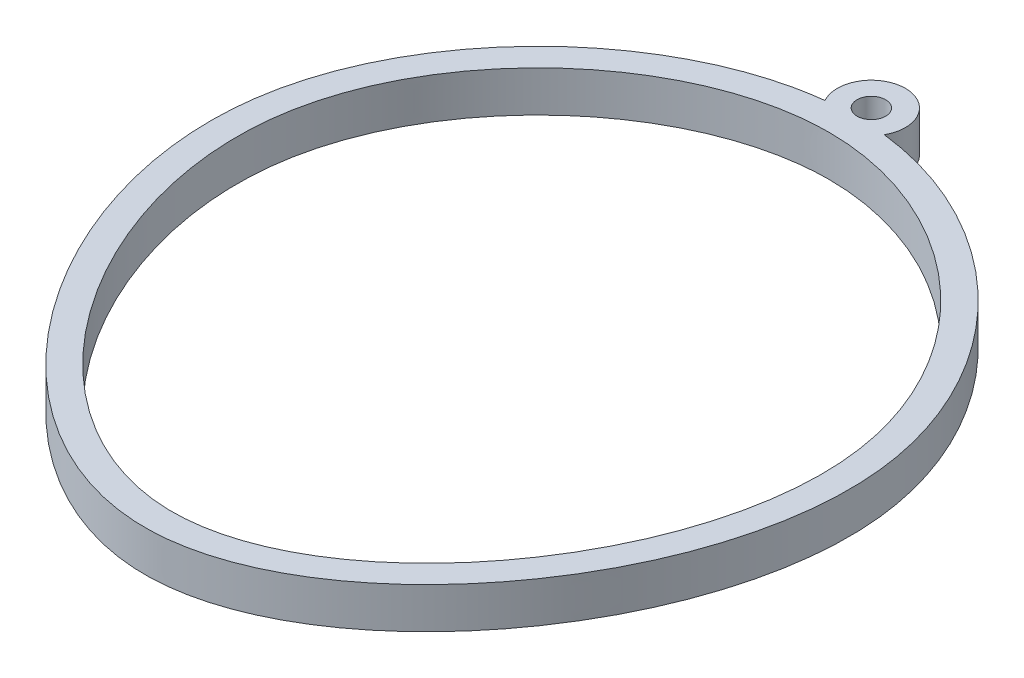
ISO-10303-21;
HEADER;
FILE_DESCRIPTION(('STEP AP214'),'2;1');
FILE_NAME('part.step','',(''),(''),'','','');
FILE_SCHEMA(('AUTOMOTIVE_DESIGN { 1 0 10303 214 1 1 1 1 }'));
ENDSEC;
DATA;
#1=APPLICATION_CONTEXT('core data for automotive mechanical design processes');
#2=APPLICATION_PROTOCOL_DEFINITION('international standard','automotive_design',2000,#1);
#3=PRODUCT_CONTEXT('',#1,'mechanical');
#4=PRODUCT('Part','Part','',(#3));
#5=PRODUCT_RELATED_PRODUCT_CATEGORY('part','',(#4));
#6=PRODUCT_DEFINITION_FORMATION('','',#4);
#7=PRODUCT_DEFINITION_CONTEXT('part definition',#1,'design');
#8=PRODUCT_DEFINITION('design','',#6,#7);
#9=PRODUCT_DEFINITION_SHAPE('','',#8);
#10=(LENGTH_UNIT() NAMED_UNIT(*) SI_UNIT(.MILLI.,.METRE.));
#11=(NAMED_UNIT(*) PLANE_ANGLE_UNIT() SI_UNIT($,.RADIAN.));
#12=(NAMED_UNIT(*) SI_UNIT($,.STERADIAN.) SOLID_ANGLE_UNIT());
#13=UNCERTAINTY_MEASURE_WITH_UNIT(LENGTH_MEASURE(1.E-05),#10,'distance_accuracy_value','');
#14=(GEOMETRIC_REPRESENTATION_CONTEXT(3) GLOBAL_UNCERTAINTY_ASSIGNED_CONTEXT((#13)) GLOBAL_UNIT_ASSIGNED_CONTEXT((#10,
#11,#12)) REPRESENTATION_CONTEXT('',''));
#15=CARTESIAN_POINT('',(0.,0.,0.));
#16=DIRECTION('',(0.,0.,1.));
#17=DIRECTION('',(1.,0.,0.));
#18=AXIS2_PLACEMENT_3D('',#15,#16,#17);
#19=CARTESIAN_POINT('',(0.,3.,-22.243));
#20=DIRECTION('',(0.,-1.,0.));
#21=DIRECTION('',(0.,0.,-1.));
#22=AXIS2_PLACEMENT_3D('',#19,#20,#21);
#23=CYLINDRICAL_SURFACE('',#22,2.50000000000001);
#24=CARTESIAN_POINT('',(0.,0.,-22.243));
#25=DIRECTION('',(0.,1.,0.));
#26=DIRECTION('',(0.,0.,1.));
#27=AXIS2_PLACEMENT_3D('',#24,#25,#26);
#28=CIRCLE('',#27,2.50000000000001);
#29=CARTESIAN_POINT('',(2.1782776813823,0.,-21.0161722440408));
#30=VERTEX_POINT('',#29);
#31=CARTESIAN_POINT('',(-2.1782776813823,0.,-21.0161722440408));
#32=VERTEX_POINT('',#31);
#33=EDGE_CURVE('E62',#30,#32,#28,.T.);
#34=ORIENTED_EDGE('',*,*,#33,.T.);
#35=DIRECTION('',(0.,-1.,0.));
#36=VECTOR('',#35,1.);
#37=CARTESIAN_POINT('',(-2.1782776813823,3.,-21.0161722440408));
#38=LINE('',#37,#36);
#39=CARTESIAN_POINT('',(-2.1782776813823,3.,-21.0161722440408));
#40=VERTEX_POINT('',#39);
#41=EDGE_CURVE('E11',#40,#32,#38,.T.);
#42=ORIENTED_EDGE('',*,*,#41,.F.);
#43=CARTESIAN_POINT('',(0.,3.,-22.243));
#44=DIRECTION('',(0.,1.,0.));
#45=DIRECTION('',(0.,0.,1.));
#46=AXIS2_PLACEMENT_3D('',#43,#44,#45);
#47=CIRCLE('',#46,2.50000000000001);
#48=CARTESIAN_POINT('',(2.1782776813823,3.,-21.0161722440408));
#49=VERTEX_POINT('',#48);
#50=EDGE_CURVE('E64',#49,#40,#47,.T.);
#51=ORIENTED_EDGE('',*,*,#50,.F.);
#52=DIRECTION('',(0.,-1.,0.));
#53=VECTOR('',#52,1.);
#54=CARTESIAN_POINT('',(2.1782776813823,3.,-21.0161722440408));
#55=LINE('',#54,#53);
#56=EDGE_CURVE('E46',#49,#30,#55,.T.);
#57=ORIENTED_EDGE('',*,*,#56,.T.);
#58=EDGE_LOOP('',(#34,#42,#51,#57));
#59=FACE_BOUND('',#58,.T.);
#60=ADVANCED_FACE('F37',(#59),#23,.T.);
#61=CARTESIAN_POINT('',(0.,3.,-21.143));
#62=CARTESIAN_POINT('',(10.895147515051,3.,-21.143));
#63=CARTESIAN_POINT('',(35.2538195250686,3.,0.474726308047918));
#64=CARTESIAN_POINT('',(0.,3.,48.0473857565571));
#65=CARTESIAN_POINT('',(-35.2538195250686,3.,0.474726308047905));
#66=CARTESIAN_POINT('',(-10.895147515051,3.,-21.143));
#67=CARTESIAN_POINT('',(0.,3.,-21.143));
#68=B_SPLINE_CURVE_WITH_KNOTS('',3,(#61,#62,#63,#64,#65,#66,#67),.UNSPECIFIED.,.T.,.F.,(4,1,1,1,
4),(0.,0.223640014335968,0.5,0.776359985664032,1.),.UNSPECIFIED.);
#69=DIRECTION('',(0.,-1.,0.));
#70=VECTOR('',#69,1.);
#71=SURFACE_OF_LINEAR_EXTRUSION('',#68,#70);
#72=CARTESIAN_POINT('',(0.,0.,-21.143));
#73=CARTESIAN_POINT('',(10.895147515051,0.,-21.143));
#74=CARTESIAN_POINT('',(35.2538195250686,0.,0.474726308047918));
#75=CARTESIAN_POINT('',(0.,0.,48.0473857565571));
#76=CARTESIAN_POINT('',(-35.2538195250686,0.,0.474726308047905));
#77=CARTESIAN_POINT('',(-10.895147515051,0.,-21.143));
#78=CARTESIAN_POINT('',(0.,0.,-21.143));
#79=B_SPLINE_CURVE_WITH_KNOTS('',3,(#72,#73,#74,#75,#76,#77,#78),.UNSPECIFIED.,.T.,.F.,(4,1,1,1,
4),(0.,0.223640014335968,0.5,0.776359985664032,1.),.UNSPECIFIED.);
#80=EDGE_CURVE('E70',#30,#32,#79,.T.);
#81=ORIENTED_EDGE('',*,*,#80,.F.);
#82=ORIENTED_EDGE('',*,*,#56,.F.);
#83=EDGE_CURVE('E97',#49,#40,#68,.T.);
#84=ORIENTED_EDGE('',*,*,#83,.T.);
#85=ORIENTED_EDGE('',*,*,#41,.T.);
#86=EDGE_LOOP('',(#81,#82,#84,#85));
#87=FACE_BOUND('',#86,.T.);
#88=ADVANCED_FACE('F73',(#87),#71,.T.);
#89=CARTESIAN_POINT('',(0.,3.,-22.243));
#90=DIRECTION('',(0.,-1.,0.));
#91=DIRECTION('',(0.,0.,-1.));
#92=AXIS2_PLACEMENT_3D('',#89,#90,#91);
#93=CYLINDRICAL_SURFACE('',#92,1.05);
#94=CARTESIAN_POINT('',(0.,3.,-22.243));
#95=DIRECTION('',(0.,1.,0.));
#96=DIRECTION('',(0.,0.,1.));
#97=AXIS2_PLACEMENT_3D('',#94,#95,#96);
#98=CIRCLE('',#97,1.05);
#99=CARTESIAN_POINT('',(0.,3.,-21.193));
#100=VERTEX_POINT('',#99);
#101=EDGE_CURVE('E77',#100,#100,#98,.T.);
#102=ORIENTED_EDGE('',*,*,#101,.T.);
#103=EDGE_LOOP('',(#102));
#104=FACE_BOUND('',#103,.T.);
#105=CARTESIAN_POINT('',(0.,0.,-22.243));
#106=DIRECTION('',(0.,1.,0.));
#107=DIRECTION('',(0.,0.,1.));
#108=AXIS2_PLACEMENT_3D('',#105,#106,#107);
#109=CIRCLE('',#108,1.05);
#110=CARTESIAN_POINT('',(0.,0.,-21.193));
#111=VERTEX_POINT('',#110);
#112=EDGE_CURVE('E71',#111,#111,#109,.T.);
#113=ORIENTED_EDGE('',*,*,#112,.F.);
#114=EDGE_LOOP('',(#113));
#115=FACE_BOUND('',#114,.T.);
#116=ADVANCED_FACE('F39',(#104,#115),#93,.F.);
#117=CARTESIAN_POINT('',(0.,3.,-19.143));
#118=CARTESIAN_POINT('',(9.90355064316213,3.,-19.143));
#119=CARTESIAN_POINT('',(32.2853152880285,3.,0.506820584334781));
#120=CARTESIAN_POINT('',(0.,3.,45.0614309742168));
#121=CARTESIAN_POINT('',(-32.2853152880285,3.,0.506820584334779));
#122=CARTESIAN_POINT('',(-9.90355064316213,3.,-19.143));
#123=CARTESIAN_POINT('',(0.,3.,-19.143));
#124=B_SPLINE_CURVE_WITH_KNOTS('',3,(#117,#118,#119,#120,#121,#122,#123),.UNSPECIFIED.,.T.,.F.,
(4,1,1,1,4),(0.,0.221241506206117,0.5,0.778758493793883,1.),.UNSPECIFIED.);
#125=DIRECTION('',(0.,-1.,0.));
#126=VECTOR('',#125,1.);
#127=SURFACE_OF_LINEAR_EXTRUSION('',#124,#126);
#128=CARTESIAN_POINT('',(0.,3.,-19.143));
#129=VERTEX_POINT('',#128);
#130=EDGE_CURVE('E66',#129,#129,#124,.T.);
#131=ORIENTED_EDGE('',*,*,#130,.F.);
#132=EDGE_LOOP('',(#131));
#133=FACE_BOUND('',#132,.T.);
#134=CARTESIAN_POINT('',(0.,0.,-19.143));
#135=CARTESIAN_POINT('',(9.90355064316213,0.,-19.143));
#136=CARTESIAN_POINT('',(32.2853152880285,0.,0.506820584334781));
#137=CARTESIAN_POINT('',(0.,0.,45.0614309742168));
#138=CARTESIAN_POINT('',(-32.2853152880285,0.,0.506820584334779));
#139=CARTESIAN_POINT('',(-9.90355064316213,0.,-19.143));
#140=CARTESIAN_POINT('',(0.,0.,-19.143));
#141=B_SPLINE_CURVE_WITH_KNOTS('',3,(#134,#135,#136,#137,#138,#139,#140),.UNSPECIFIED.,.T.,.F.,
(4,1,1,1,4),(0.,0.221241506206117,0.5,0.778758493793883,1.),.UNSPECIFIED.);
#142=CARTESIAN_POINT('',(0.,0.,-19.143));
#143=VERTEX_POINT('',#142);
#144=EDGE_CURVE('E74',#143,#143,#141,.T.);
#145=ORIENTED_EDGE('',*,*,#144,.T.);
#146=EDGE_LOOP('',(#145));
#147=FACE_BOUND('',#146,.T.);
#148=ADVANCED_FACE('F106',(#133,#147),#127,.F.);
#149=CARTESIAN_POINT('',(0.,3.,0.));
#150=DIRECTION('',(0.,1.,0.));
#151=DIRECTION('',(0.,0.,1.));
#152=AXIS2_PLACEMENT_3D('',#149,#150,#151);
#153=PLANE('',#152);
#154=ORIENTED_EDGE('',*,*,#101,.F.);
#155=EDGE_LOOP('',(#154));
#156=FACE_BOUND('',#155,.T.);
#157=ORIENTED_EDGE('',*,*,#50,.T.);
#158=ORIENTED_EDGE('',*,*,#83,.F.);
#159=EDGE_LOOP('',(#157,#158));
#160=FACE_BOUND('',#159,.T.);
#161=ORIENTED_EDGE('',*,*,#130,.T.);
#162=EDGE_LOOP('',(#161));
#163=FACE_BOUND('',#162,.T.);
#164=ADVANCED_FACE('F110',(#156,#160,#163),#153,.T.);
#165=CARTESIAN_POINT('',(0.,0.,0.));
#166=DIRECTION('',(0.,1.,0.));
#167=DIRECTION('',(0.,0.,1.));
#168=AXIS2_PLACEMENT_3D('',#165,#166,#167);
#169=PLANE('',#168);
#170=ORIENTED_EDGE('',*,*,#112,.T.);
#171=EDGE_LOOP('',(#170));
#172=FACE_BOUND('',#171,.T.);
#173=ORIENTED_EDGE('',*,*,#33,.F.);
#174=ORIENTED_EDGE('',*,*,#80,.T.);
#175=EDGE_LOOP('',(#173,#174));
#176=FACE_BOUND('',#175,.T.);
#177=ORIENTED_EDGE('',*,*,#144,.F.);
#178=EDGE_LOOP('',(#177));
#179=FACE_BOUND('',#178,.T.);
#180=ADVANCED_FACE('F68',(#172,#176,#179),#169,.F.);
#181=CLOSED_SHELL('',(#60,#88,#116,#148,#164,#180));
#182=MANIFOLD_SOLID_BREP('B2',#181);
#183=ADVANCED_BREP_SHAPE_REPRESENTATION('',(#18,#182),#14);
#184=SHAPE_DEFINITION_REPRESENTATION(#9,#183);
ENDSEC;
END-ISO-10303-21;
